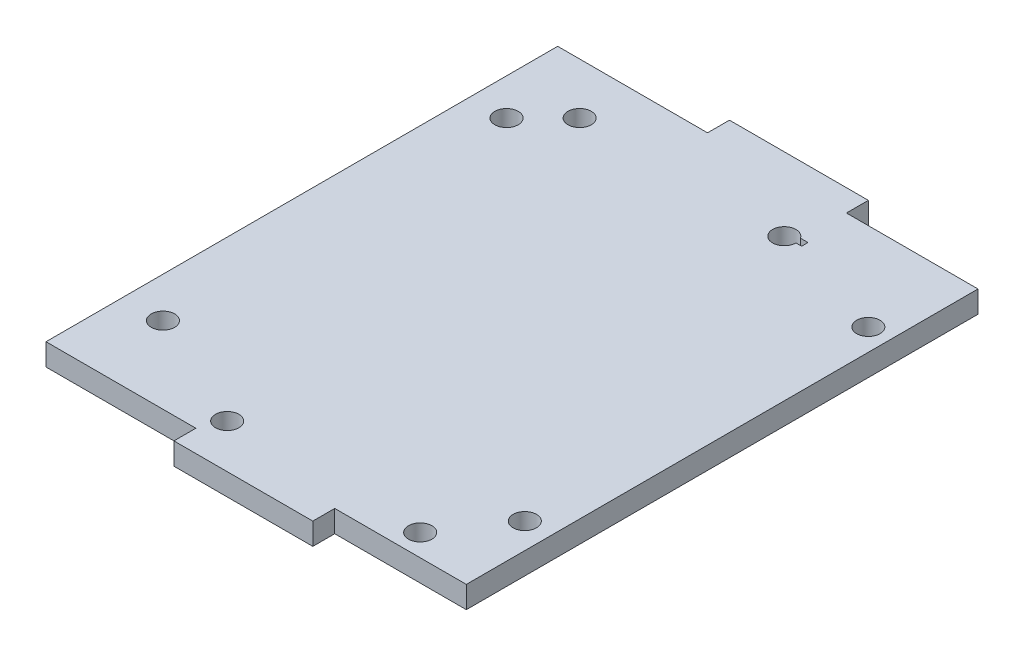
ISO-10303-21;
HEADER;
FILE_DESCRIPTION(('STEP AP214'),'2;1');
FILE_NAME('part.step','',(''),(''),'','','');
FILE_SCHEMA(('AUTOMOTIVE_DESIGN { 1 0 10303 214 1 1 1 1 }'));
ENDSEC;
DATA;
#1=APPLICATION_CONTEXT('core data for automotive mechanical design processes');
#2=APPLICATION_PROTOCOL_DEFINITION('international standard','automotive_design',2000,#1);
#3=PRODUCT_CONTEXT('',#1,'mechanical');
#4=PRODUCT('Part','Part','',(#3));
#5=PRODUCT_RELATED_PRODUCT_CATEGORY('part','',(#4));
#6=PRODUCT_DEFINITION_FORMATION('','',#4);
#7=PRODUCT_DEFINITION_CONTEXT('part definition',#1,'design');
#8=PRODUCT_DEFINITION('design','',#6,#7);
#9=PRODUCT_DEFINITION_SHAPE('','',#8);
#10=(LENGTH_UNIT() NAMED_UNIT(*) SI_UNIT(.MILLI.,.METRE.));
#11=(NAMED_UNIT(*) PLANE_ANGLE_UNIT() SI_UNIT($,.RADIAN.));
#12=(NAMED_UNIT(*) SI_UNIT($,.STERADIAN.) SOLID_ANGLE_UNIT());
#13=UNCERTAINTY_MEASURE_WITH_UNIT(LENGTH_MEASURE(1.E-05),#10,'distance_accuracy_value','');
#14=(GEOMETRIC_REPRESENTATION_CONTEXT(3) GLOBAL_UNCERTAINTY_ASSIGNED_CONTEXT((#13)) GLOBAL_UNIT_ASSIGNED_CONTEXT((#10,
#11,#12)) REPRESENTATION_CONTEXT('',''));
#15=CARTESIAN_POINT('',(0.,0.,0.));
#16=DIRECTION('',(0.,0.,1.));
#17=DIRECTION('',(1.,0.,0.));
#18=AXIS2_PLACEMENT_3D('',#15,#16,#17);
#19=CARTESIAN_POINT('',(0.,3.,35.));
#20=DIRECTION('',(0.,0.,-1.));
#21=DIRECTION('',(-1.,0.,0.));
#22=AXIS2_PLACEMENT_3D('',#19,#20,#21);
#23=PLANE('',#22);
#24=DIRECTION('',(1.,0.,0.));
#25=VECTOR('',#24,1.);
#26=CARTESIAN_POINT('',(0.,0.,35.));
#27=LINE('',#26,#25);
#28=CARTESIAN_POINT('',(6.29786164027668,0.,35.));
#29=VERTEX_POINT('',#28);
#30=CARTESIAN_POINT('',(26.7978616402767,0.,35.));
#31=VERTEX_POINT('',#30);
#32=EDGE_CURVE('E205',#29,#31,#27,.T.);
#33=ORIENTED_EDGE('',*,*,#32,.T.);
#34=DIRECTION('',(0.,-1.,0.));
#35=VECTOR('',#34,1.);
#36=CARTESIAN_POINT('',(26.7978616402767,3.,35.));
#37=LINE('',#36,#35);
#38=CARTESIAN_POINT('',(26.7978616402767,3.,35.));
#39=VERTEX_POINT('',#38);
#40=EDGE_CURVE('E11',#39,#31,#37,.T.);
#41=ORIENTED_EDGE('',*,*,#40,.F.);
#42=DIRECTION('',(1.,0.,0.));
#43=VECTOR('',#42,1.);
#44=CARTESIAN_POINT('',(0.,3.,35.));
#45=LINE('',#44,#43);
#46=CARTESIAN_POINT('',(6.29786164027668,3.,35.));
#47=VERTEX_POINT('',#46);
#48=EDGE_CURVE('E382',#47,#39,#45,.T.);
#49=ORIENTED_EDGE('',*,*,#48,.F.);
#50=DIRECTION('',(0.,-1.,0.));
#51=VECTOR('',#50,1.);
#52=CARTESIAN_POINT('',(6.29786164027668,3.,35.));
#53=LINE('',#52,#51);
#54=EDGE_CURVE('E233',#47,#29,#53,.T.);
#55=ORIENTED_EDGE('',*,*,#54,.T.);
#56=EDGE_LOOP('',(#33,#41,#49,#55));
#57=FACE_BOUND('',#56,.T.);
#58=ADVANCED_FACE('F36',(#57),#23,.F.);
#59=CARTESIAN_POINT('',(26.7978616402767,3.,0.));
#60=DIRECTION('',(1.,0.,0.));
#61=DIRECTION('',(0.,0.,-1.));
#62=AXIS2_PLACEMENT_3D('',#59,#60,#61);
#63=PLANE('',#62);
#64=DIRECTION('',(0.,0.,1.));
#65=VECTOR('',#64,1.);
#66=CARTESIAN_POINT('',(26.7978616402767,0.,0.));
#67=LINE('',#66,#65);
#68=CARTESIAN_POINT('',(26.7978616402767,0.,38.));
#69=VERTEX_POINT('',#68);
#70=EDGE_CURVE('E208',#31,#69,#67,.T.);
#71=ORIENTED_EDGE('',*,*,#70,.T.);
#72=DIRECTION('',(0.,-1.,0.));
#73=VECTOR('',#72,1.);
#74=CARTESIAN_POINT('',(26.7978616402767,3.,38.));
#75=LINE('',#74,#73);
#76=CARTESIAN_POINT('',(26.7978616402767,3.,38.));
#77=VERTEX_POINT('',#76);
#78=EDGE_CURVE('E46',#77,#69,#75,.T.);
#79=ORIENTED_EDGE('',*,*,#78,.F.);
#80=DIRECTION('',(0.,0.,1.));
#81=VECTOR('',#80,1.);
#82=CARTESIAN_POINT('',(26.7978616402767,3.,0.));
#83=LINE('',#82,#81);
#84=EDGE_CURVE('E383',#39,#77,#83,.T.);
#85=ORIENTED_EDGE('',*,*,#84,.F.);
#86=ORIENTED_EDGE('',*,*,#40,.T.);
#87=EDGE_LOOP('',(#71,#79,#85,#86));
#88=FACE_BOUND('',#87,.T.);
#89=ADVANCED_FACE('F289',(#88),#63,.F.);
#90=CARTESIAN_POINT('',(0.,3.,38.));
#91=DIRECTION('',(0.,0.,-1.));
#92=DIRECTION('',(-1.,0.,0.));
#93=AXIS2_PLACEMENT_3D('',#90,#91,#92);
#94=PLANE('',#93);
#95=DIRECTION('',(1.,0.,0.));
#96=VECTOR('',#95,1.);
#97=CARTESIAN_POINT('',(0.,0.,38.));
#98=LINE('',#97,#96);
#99=CARTESIAN_POINT('',(45.7978616402767,0.,38.));
#100=VERTEX_POINT('',#99);
#101=EDGE_CURVE('E210',#69,#100,#98,.T.);
#102=ORIENTED_EDGE('',*,*,#101,.T.);
#103=DIRECTION('',(0.,-1.,0.));
#104=VECTOR('',#103,1.);
#105=CARTESIAN_POINT('',(45.7978616402767,3.,38.));
#106=LINE('',#105,#104);
#107=CARTESIAN_POINT('',(45.7978616402767,3.,38.));
#108=VERTEX_POINT('',#107);
#109=EDGE_CURVE('E249',#108,#100,#106,.T.);
#110=ORIENTED_EDGE('',*,*,#109,.F.);
#111=DIRECTION('',(1.,0.,0.));
#112=VECTOR('',#111,1.);
#113=CARTESIAN_POINT('',(0.,3.,38.));
#114=LINE('',#113,#112);
#115=EDGE_CURVE('E386',#77,#108,#114,.T.);
#116=ORIENTED_EDGE('',*,*,#115,.F.);
#117=ORIENTED_EDGE('',*,*,#78,.T.);
#118=EDGE_LOOP('',(#102,#110,#116,#117));
#119=FACE_BOUND('',#118,.T.);
#120=ADVANCED_FACE('F295',(#119),#94,.F.);
#121=CARTESIAN_POINT('',(45.7978616402767,3.,0.));
#122=DIRECTION('',(-1.,0.,0.));
#123=DIRECTION('',(0.,0.,1.));
#124=AXIS2_PLACEMENT_3D('',#121,#122,#123);
#125=PLANE('',#124);
#126=DIRECTION('',(0.,0.,-1.));
#127=VECTOR('',#126,1.);
#128=CARTESIAN_POINT('',(45.7978616402767,0.,0.));
#129=LINE('',#128,#127);
#130=CARTESIAN_POINT('',(45.7978616402767,0.,35.));
#131=VERTEX_POINT('',#130);
#132=EDGE_CURVE('E212',#100,#131,#129,.T.);
#133=ORIENTED_EDGE('',*,*,#132,.T.);
#134=DIRECTION('',(0.,-1.,0.));
#135=VECTOR('',#134,1.);
#136=CARTESIAN_POINT('',(45.7978616402767,3.,35.));
#137=LINE('',#136,#135);
#138=CARTESIAN_POINT('',(45.7978616402767,3.,35.));
#139=VERTEX_POINT('',#138);
#140=EDGE_CURVE('E246',#139,#131,#137,.T.);
#141=ORIENTED_EDGE('',*,*,#140,.F.);
#142=DIRECTION('',(0.,0.,-1.));
#143=VECTOR('',#142,1.);
#144=CARTESIAN_POINT('',(45.7978616402767,3.,0.));
#145=LINE('',#144,#143);
#146=EDGE_CURVE('E358',#108,#139,#145,.T.);
#147=ORIENTED_EDGE('',*,*,#146,.F.);
#148=ORIENTED_EDGE('',*,*,#109,.T.);
#149=EDGE_LOOP('',(#133,#141,#147,#148));
#150=FACE_BOUND('',#149,.T.);
#151=ADVANCED_FACE('F342',(#150),#125,.F.);
#152=CARTESIAN_POINT('',(0.,3.,35.));
#153=DIRECTION('',(0.,0.,-1.));
#154=DIRECTION('',(-1.,0.,0.));
#155=AXIS2_PLACEMENT_3D('',#152,#153,#154);
#156=PLANE('',#155);
#157=DIRECTION('',(1.,0.,0.));
#158=VECTOR('',#157,1.);
#159=CARTESIAN_POINT('',(0.,0.,35.));
#160=LINE('',#159,#158);
#161=CARTESIAN_POINT('',(63.7978616402767,0.,35.));
#162=VERTEX_POINT('',#161);
#163=EDGE_CURVE('E214',#131,#162,#160,.T.);
#164=ORIENTED_EDGE('',*,*,#163,.T.);
#165=DIRECTION('',(0.,-1.,0.));
#166=VECTOR('',#165,1.);
#167=CARTESIAN_POINT('',(63.7978616402767,3.,35.));
#168=LINE('',#167,#166);
#169=CARTESIAN_POINT('',(63.7978616402767,3.,35.));
#170=VERTEX_POINT('',#169);
#171=EDGE_CURVE('E243',#170,#162,#168,.T.);
#172=ORIENTED_EDGE('',*,*,#171,.F.);
#173=DIRECTION('',(1.,0.,0.));
#174=VECTOR('',#173,1.);
#175=CARTESIAN_POINT('',(0.,3.,35.));
#176=LINE('',#175,#174);
#177=EDGE_CURVE('E370',#139,#170,#176,.T.);
#178=ORIENTED_EDGE('',*,*,#177,.F.);
#179=ORIENTED_EDGE('',*,*,#140,.T.);
#180=EDGE_LOOP('',(#164,#172,#178,#179));
#181=FACE_BOUND('',#180,.T.);
#182=ADVANCED_FACE('F338',(#181),#156,.F.);
#183=CARTESIAN_POINT('',(63.7978616402767,3.,0.));
#184=DIRECTION('',(-1.,0.,0.));
#185=DIRECTION('',(0.,0.,1.));
#186=AXIS2_PLACEMENT_3D('',#183,#184,#185);
#187=PLANE('',#186);
#188=DIRECTION('',(0.,0.,-1.));
#189=VECTOR('',#188,1.);
#190=CARTESIAN_POINT('',(63.7978616402767,0.,0.));
#191=LINE('',#190,#189);
#192=CARTESIAN_POINT('',(63.7978616402767,0.,-35.));
#193=VERTEX_POINT('',#192);
#194=EDGE_CURVE('E216',#162,#193,#191,.T.);
#195=ORIENTED_EDGE('',*,*,#194,.T.);
#196=DIRECTION('',(0.,-1.,0.));
#197=VECTOR('',#196,1.);
#198=CARTESIAN_POINT('',(63.7978616402767,3.,-35.));
#199=LINE('',#198,#197);
#200=CARTESIAN_POINT('',(63.7978616402767,3.,-35.));
#201=VERTEX_POINT('',#200);
#202=EDGE_CURVE('E241',#201,#193,#199,.T.);
#203=ORIENTED_EDGE('',*,*,#202,.F.);
#204=DIRECTION('',(0.,0.,-1.));
#205=VECTOR('',#204,1.);
#206=CARTESIAN_POINT('',(63.7978616402767,3.,0.));
#207=LINE('',#206,#205);
#208=EDGE_CURVE('E366',#170,#201,#207,.T.);
#209=ORIENTED_EDGE('',*,*,#208,.F.);
#210=ORIENTED_EDGE('',*,*,#171,.T.);
#211=EDGE_LOOP('',(#195,#203,#209,#210));
#212=FACE_BOUND('',#211,.T.);
#213=ADVANCED_FACE('F334',(#212),#187,.F.);
#214=CARTESIAN_POINT('',(0.,3.,-35.));
#215=DIRECTION('',(0.,0.,-1.));
#216=DIRECTION('',(-1.,0.,0.));
#217=AXIS2_PLACEMENT_3D('',#214,#215,#216);
#218=PLANE('',#217);
#219=DIRECTION('',(1.,0.,0.));
#220=VECTOR('',#219,1.);
#221=CARTESIAN_POINT('',(0.,0.,-35.));
#222=LINE('',#221,#220);
#223=CARTESIAN_POINT('',(45.7978616402767,0.,-35.));
#224=VERTEX_POINT('',#223);
#225=EDGE_CURVE('E219',#224,#193,#222,.T.);
#226=ORIENTED_EDGE('',*,*,#225,.F.);
#227=DIRECTION('',(0.,-1.,0.));
#228=VECTOR('',#227,1.);
#229=CARTESIAN_POINT('',(45.7978616402767,3.,-35.));
#230=LINE('',#229,#228);
#231=CARTESIAN_POINT('',(45.7978616402767,3.,-35.));
#232=VERTEX_POINT('',#231);
#233=EDGE_CURVE('E239',#232,#224,#230,.T.);
#234=ORIENTED_EDGE('',*,*,#233,.F.);
#235=DIRECTION('',(1.,0.,0.));
#236=VECTOR('',#235,1.);
#237=CARTESIAN_POINT('',(0.,3.,-35.));
#238=LINE('',#237,#236);
#239=EDGE_CURVE('E369',#232,#201,#238,.T.);
#240=ORIENTED_EDGE('',*,*,#239,.T.);
#241=ORIENTED_EDGE('',*,*,#202,.T.);
#242=EDGE_LOOP('',(#226,#234,#240,#241));
#243=FACE_BOUND('',#242,.T.);
#244=ADVANCED_FACE('F330',(#243),#218,.T.);
#245=CARTESIAN_POINT('',(45.7978616402767,3.,0.));
#246=DIRECTION('',(1.,0.,0.));
#247=DIRECTION('',(0.,0.,-1.));
#248=AXIS2_PLACEMENT_3D('',#245,#246,#247);
#249=PLANE('',#248);
#250=DIRECTION('',(0.,0.,1.));
#251=VECTOR('',#250,1.);
#252=CARTESIAN_POINT('',(45.7978616402767,0.,0.));
#253=LINE('',#252,#251);
#254=CARTESIAN_POINT('',(45.7978616402767,0.,-38.));
#255=VERTEX_POINT('',#254);
#256=EDGE_CURVE('E222',#255,#224,#253,.T.);
#257=ORIENTED_EDGE('',*,*,#256,.F.);
#258=DIRECTION('',(0.,-1.,0.));
#259=VECTOR('',#258,1.);
#260=CARTESIAN_POINT('',(45.7978616402767,3.,-38.));
#261=LINE('',#260,#259);
#262=CARTESIAN_POINT('',(45.7978616402767,3.,-38.));
#263=VERTEX_POINT('',#262);
#264=EDGE_CURVE('E237',#263,#255,#261,.T.);
#265=ORIENTED_EDGE('',*,*,#264,.F.);
#266=DIRECTION('',(0.,0.,1.));
#267=VECTOR('',#266,1.);
#268=CARTESIAN_POINT('',(45.7978616402767,3.,0.));
#269=LINE('',#268,#267);
#270=EDGE_CURVE('E372',#263,#232,#269,.T.);
#271=ORIENTED_EDGE('',*,*,#270,.T.);
#272=ORIENTED_EDGE('',*,*,#233,.T.);
#273=EDGE_LOOP('',(#257,#265,#271,#272));
#274=FACE_BOUND('',#273,.T.);
#275=ADVANCED_FACE('F326',(#274),#249,.T.);
#276=CARTESIAN_POINT('',(0.,3.,-38.));
#277=DIRECTION('',(0.,0.,-1.));
#278=DIRECTION('',(-1.,0.,0.));
#279=AXIS2_PLACEMENT_3D('',#276,#277,#278);
#280=PLANE('',#279);
#281=DIRECTION('',(1.,0.,0.));
#282=VECTOR('',#281,1.);
#283=CARTESIAN_POINT('',(0.,0.,-38.));
#284=LINE('',#283,#282);
#285=CARTESIAN_POINT('',(26.7978616402767,0.,-38.));
#286=VERTEX_POINT('',#285);
#287=EDGE_CURVE('E225',#286,#255,#284,.T.);
#288=ORIENTED_EDGE('',*,*,#287,.F.);
#289=DIRECTION('',(0.,-1.,0.));
#290=VECTOR('',#289,1.);
#291=CARTESIAN_POINT('',(26.7978616402767,3.,-38.));
#292=LINE('',#291,#290);
#293=CARTESIAN_POINT('',(26.7978616402767,3.,-38.));
#294=VERTEX_POINT('',#293);
#295=EDGE_CURVE('E168',#294,#286,#292,.T.);
#296=ORIENTED_EDGE('',*,*,#295,.F.);
#297=DIRECTION('',(1.,0.,0.));
#298=VECTOR('',#297,1.);
#299=CARTESIAN_POINT('',(0.,3.,-38.));
#300=LINE('',#299,#298);
#301=EDGE_CURVE('E175',#294,#263,#300,.T.);
#302=ORIENTED_EDGE('',*,*,#301,.T.);
#303=ORIENTED_EDGE('',*,*,#264,.T.);
#304=EDGE_LOOP('',(#288,#296,#302,#303));
#305=FACE_BOUND('',#304,.T.);
#306=ADVANCED_FACE('F323',(#305),#280,.T.);
#307=CARTESIAN_POINT('',(26.7978616402767,3.,0.));
#308=DIRECTION('',(-1.,0.,0.));
#309=DIRECTION('',(0.,0.,1.));
#310=AXIS2_PLACEMENT_3D('',#307,#308,#309);
#311=PLANE('',#310);
#312=DIRECTION('',(0.,0.,-1.));
#313=VECTOR('',#312,1.);
#314=CARTESIAN_POINT('',(26.7978616402767,0.,0.));
#315=LINE('',#314,#313);
#316=CARTESIAN_POINT('',(26.7978616402767,0.,-35.));
#317=VERTEX_POINT('',#316);
#318=EDGE_CURVE('E163',#317,#286,#315,.T.);
#319=ORIENTED_EDGE('',*,*,#318,.F.);
#320=DIRECTION('',(0.,-1.,0.));
#321=VECTOR('',#320,1.);
#322=CARTESIAN_POINT('',(26.7978616402767,3.,-35.));
#323=LINE('',#322,#321);
#324=CARTESIAN_POINT('',(26.7978616402767,3.,-35.));
#325=VERTEX_POINT('',#324);
#326=EDGE_CURVE('E158',#325,#317,#323,.T.);
#327=ORIENTED_EDGE('',*,*,#326,.F.);
#328=DIRECTION('',(0.,0.,-1.));
#329=VECTOR('',#328,1.);
#330=CARTESIAN_POINT('',(26.7978616402767,3.,0.));
#331=LINE('',#330,#329);
#332=EDGE_CURVE('E161',#325,#294,#331,.T.);
#333=ORIENTED_EDGE('',*,*,#332,.T.);
#334=ORIENTED_EDGE('',*,*,#295,.T.);
#335=EDGE_LOOP('',(#319,#327,#333,#334));
#336=FACE_BOUND('',#335,.T.);
#337=ADVANCED_FACE('F160',(#336),#311,.T.);
#338=CARTESIAN_POINT('',(0.,3.,-35.));
#339=DIRECTION('',(0.,0.,-1.));
#340=DIRECTION('',(-1.,0.,0.));
#341=AXIS2_PLACEMENT_3D('',#338,#339,#340);
#342=PLANE('',#341);
#343=DIRECTION('',(1.,0.,0.));
#344=VECTOR('',#343,1.);
#345=CARTESIAN_POINT('',(0.,0.,-35.));
#346=LINE('',#345,#344);
#347=CARTESIAN_POINT('',(6.29786164027668,0.,-35.));
#348=VERTEX_POINT('',#347);
#349=EDGE_CURVE('E229',#348,#317,#346,.T.);
#350=ORIENTED_EDGE('',*,*,#349,.F.);
#351=DIRECTION('',(0.,-1.,0.));
#352=VECTOR('',#351,1.);
#353=CARTESIAN_POINT('',(6.29786164027668,3.,-35.));
#354=LINE('',#353,#352);
#355=CARTESIAN_POINT('',(6.29786164027668,3.,-35.));
#356=VERTEX_POINT('',#355);
#357=EDGE_CURVE('E107',#356,#348,#354,.T.);
#358=ORIENTED_EDGE('',*,*,#357,.F.);
#359=DIRECTION('',(1.,0.,0.));
#360=VECTOR('',#359,1.);
#361=CARTESIAN_POINT('',(0.,3.,-35.));
#362=LINE('',#361,#360);
#363=EDGE_CURVE('E172',#356,#325,#362,.T.);
#364=ORIENTED_EDGE('',*,*,#363,.T.);
#365=ORIENTED_EDGE('',*,*,#326,.T.);
#366=EDGE_LOOP('',(#350,#358,#364,#365));
#367=FACE_BOUND('',#366,.T.);
#368=ADVANCED_FACE('F177',(#367),#342,.T.);
#369=CARTESIAN_POINT('',(44.2978616402767,3.,-28.));
#370=DIRECTION('',(0.,-1.,0.));
#371=DIRECTION('',(0.,0.,-1.));
#372=AXIS2_PLACEMENT_3D('',#369,#370,#371);
#373=CYLINDRICAL_SURFACE('',#372,1.6);
#374=CARTESIAN_POINT('',(44.2978616402767,0.,-28.));
#375=DIRECTION('',(0.,1.,0.));
#376=DIRECTION('',(0.,0.,1.));
#377=AXIS2_PLACEMENT_3D('',#374,#375,#376);
#378=CIRCLE('',#377,1.6);
#379=CARTESIAN_POINT('',(45.6374800853069,0.,-28.8748842333331));
#380=VERTEX_POINT('',#379);
#381=CARTESIAN_POINT('',(45.8978616402767,0.,-28.));
#382=VERTEX_POINT('',#381);
#383=EDGE_CURVE('E183',#380,#382,#378,.T.);
#384=ORIENTED_EDGE('',*,*,#383,.F.);
#385=DIRECTION('',(0.,-1.,0.));
#386=VECTOR('',#385,1.);
#387=CARTESIAN_POINT('',(45.6374800853069,3.,-28.8748842333331));
#388=LINE('',#387,#386);
#389=CARTESIAN_POINT('',(45.6374800853069,3.,-28.8748842333331));
#390=VERTEX_POINT('',#389);
#391=EDGE_CURVE('E40',#390,#380,#388,.T.);
#392=ORIENTED_EDGE('',*,*,#391,.F.);
#393=CARTESIAN_POINT('',(44.2978616402767,3.,-28.));
#394=DIRECTION('',(0.,1.,0.));
#395=DIRECTION('',(0.,0.,1.));
#396=AXIS2_PLACEMENT_3D('',#393,#394,#395);
#397=CIRCLE('',#396,1.6);
#398=CARTESIAN_POINT('',(45.8978616402767,3.,-28.));
#399=VERTEX_POINT('',#398);
#400=EDGE_CURVE('E232',#390,#399,#397,.T.);
#401=ORIENTED_EDGE('',*,*,#400,.T.);
#402=DIRECTION('',(0.,-1.,0.));
#403=VECTOR('',#402,1.);
#404=CARTESIAN_POINT('',(45.8978616402767,3.,-28.));
#405=LINE('',#404,#403);
#406=EDGE_CURVE('E179',#399,#382,#405,.T.);
#407=ORIENTED_EDGE('',*,*,#406,.T.);
#408=EDGE_LOOP('',(#384,#392,#401,#407));
#409=FACE_BOUND('',#408,.T.);
#410=ADVANCED_FACE('F38',(#409),#373,.F.);
#411=CARTESIAN_POINT('',(0.,3.,-28.8748842333331));
#412=DIRECTION('',(0.,0.,-1.));
#413=DIRECTION('',(-1.,0.,0.));
#414=AXIS2_PLACEMENT_3D('',#411,#412,#413);
#415=PLANE('',#414);
#416=DIRECTION('',(1.,0.,0.));
#417=VECTOR('',#416,1.);
#418=CARTESIAN_POINT('',(0.,0.,-28.8748842333331));
#419=LINE('',#418,#417);
#420=CARTESIAN_POINT('',(46.6680555557543,0.,-28.8748842333331));
#421=VERTEX_POINT('',#420);
#422=EDGE_CURVE('E186',#380,#421,#419,.T.);
#423=ORIENTED_EDGE('',*,*,#422,.T.);
#424=DIRECTION('',(0.,-1.,0.));
#425=VECTOR('',#424,1.);
#426=CARTESIAN_POINT('',(46.6680555557543,3.,-28.8748842333331));
#427=LINE('',#426,#425);
#428=CARTESIAN_POINT('',(46.6680555557543,3.,-28.8748842333331));
#429=VERTEX_POINT('',#428);
#430=EDGE_CURVE('E256',#429,#421,#427,.T.);
#431=ORIENTED_EDGE('',*,*,#430,.F.);
#432=DIRECTION('',(1.,0.,0.));
#433=VECTOR('',#432,1.);
#434=CARTESIAN_POINT('',(0.,3.,-28.8748842333331));
#435=LINE('',#434,#433);
#436=EDGE_CURVE('E264',#390,#429,#435,.T.);
#437=ORIENTED_EDGE('',*,*,#436,.F.);
#438=ORIENTED_EDGE('',*,*,#391,.T.);
#439=EDGE_LOOP('',(#423,#431,#437,#438));
#440=FACE_BOUND('',#439,.T.);
#441=ADVANCED_FACE('F263',(#440),#415,.F.);
#442=CARTESIAN_POINT('',(46.6680555557543,3.,0.));
#443=DIRECTION('',(-1.,0.,0.));
#444=DIRECTION('',(0.,0.,1.));
#445=AXIS2_PLACEMENT_3D('',#442,#443,#444);
#446=PLANE('',#445);
#447=DIRECTION('',(0.,0.,-1.));
#448=VECTOR('',#447,1.);
#449=CARTESIAN_POINT('',(46.6680555557543,0.,0.));
#450=LINE('',#449,#448);
#451=CARTESIAN_POINT('',(46.6680555557543,0.,-28.));
#452=VERTEX_POINT('',#451);
#453=EDGE_CURVE('E190',#452,#421,#450,.T.);
#454=ORIENTED_EDGE('',*,*,#453,.F.);
#455=DIRECTION('',(0.,-1.,0.));
#456=VECTOR('',#455,1.);
#457=CARTESIAN_POINT('',(46.6680555557543,3.,-28.));
#458=LINE('',#457,#456);
#459=CARTESIAN_POINT('',(46.6680555557543,3.,-28.));
#460=VERTEX_POINT('',#459);
#461=EDGE_CURVE('E255',#460,#452,#458,.T.);
#462=ORIENTED_EDGE('',*,*,#461,.F.);
#463=DIRECTION('',(0.,0.,-1.));
#464=VECTOR('',#463,1.);
#465=CARTESIAN_POINT('',(46.6680555557543,3.,0.));
#466=LINE('',#465,#464);
#467=EDGE_CURVE('E399',#460,#429,#466,.T.);
#468=ORIENTED_EDGE('',*,*,#467,.T.);
#469=ORIENTED_EDGE('',*,*,#430,.T.);
#470=EDGE_LOOP('',(#454,#462,#468,#469));
#471=FACE_BOUND('',#470,.T.);
#472=ADVANCED_FACE('F276',(#471),#446,.T.);
#473=CARTESIAN_POINT('',(11.7978616402767,3.,24.5));
#474=DIRECTION('',(0.,-1.,0.));
#475=DIRECTION('',(0.,0.,-1.));
#476=AXIS2_PLACEMENT_3D('',#473,#474,#475);
#477=CYLINDRICAL_SURFACE('',#476,1.6);
#478=CARTESIAN_POINT('',(11.7978616402767,3.,24.5));
#479=DIRECTION('',(0.,1.,0.));
#480=DIRECTION('',(0.,0.,1.));
#481=AXIS2_PLACEMENT_3D('',#478,#479,#480);
#482=CIRCLE('',#481,1.6);
#483=CARTESIAN_POINT('',(11.7978616402767,3.,26.1));
#484=VERTEX_POINT('',#483);
#485=EDGE_CURVE('E384',#484,#484,#482,.T.);
#486=ORIENTED_EDGE('',*,*,#485,.T.);
#487=EDGE_LOOP('',(#486));
#488=FACE_BOUND('',#487,.T.);
#489=CARTESIAN_POINT('',(11.7978616402767,0.,24.5));
#490=DIRECTION('',(0.,1.,0.));
#491=DIRECTION('',(0.,0.,1.));
#492=AXIS2_PLACEMENT_3D('',#489,#490,#491);
#493=CIRCLE('',#492,1.6);
#494=CARTESIAN_POINT('',(11.7978616402767,0.,26.1));
#495=VERTEX_POINT('',#494);
#496=EDGE_CURVE('E202',#495,#495,#493,.T.);
#497=ORIENTED_EDGE('',*,*,#496,.F.);
#498=EDGE_LOOP('',(#497));
#499=FACE_BOUND('',#498,.T.);
#500=ADVANCED_FACE('F278',(#488,#499),#477,.F.);
#501=CARTESIAN_POINT('',(60.2978616402767,3.,23.5));
#502=DIRECTION('',(0.,-1.,0.));
#503=DIRECTION('',(0.,0.,-1.));
#504=AXIS2_PLACEMENT_3D('',#501,#502,#503);
#505=CYLINDRICAL_SURFACE('',#504,1.6);
#506=CARTESIAN_POINT('',(60.2978616402767,3.,23.5));
#507=DIRECTION('',(0.,1.,0.));
#508=DIRECTION('',(0.,0.,1.));
#509=AXIS2_PLACEMENT_3D('',#506,#507,#508);
#510=CIRCLE('',#509,1.6);
#511=CARTESIAN_POINT('',(60.2978616402767,3.,25.1));
#512=VERTEX_POINT('',#511);
#513=EDGE_CURVE('E389',#512,#512,#510,.T.);
#514=ORIENTED_EDGE('',*,*,#513,.T.);
#515=EDGE_LOOP('',(#514));
#516=FACE_BOUND('',#515,.T.);
#517=CARTESIAN_POINT('',(60.2978616402767,0.,23.5));
#518=DIRECTION('',(0.,1.,0.));
#519=DIRECTION('',(0.,0.,1.));
#520=AXIS2_PLACEMENT_3D('',#517,#518,#519);
#521=CIRCLE('',#520,1.6);
#522=CARTESIAN_POINT('',(60.2978616402767,0.,25.1));
#523=VERTEX_POINT('',#522);
#524=EDGE_CURVE('E199',#523,#523,#521,.T.);
#525=ORIENTED_EDGE('',*,*,#524,.F.);
#526=EDGE_LOOP('',(#525));
#527=FACE_BOUND('',#526,.T.);
#528=ADVANCED_FACE('F284',(#516,#527),#505,.F.);
#529=CARTESIAN_POINT('',(16.2978616402767,3.,-28.));
#530=DIRECTION('',(0.,-1.,0.));
#531=DIRECTION('',(0.,0.,-1.));
#532=AXIS2_PLACEMENT_3D('',#529,#530,#531);
#533=CYLINDRICAL_SURFACE('',#532,1.6);
#534=CARTESIAN_POINT('',(16.2978616402767,3.,-28.));
#535=DIRECTION('',(0.,1.,0.));
#536=DIRECTION('',(0.,0.,1.));
#537=AXIS2_PLACEMENT_3D('',#534,#535,#536);
#538=CIRCLE('',#537,1.6);
#539=CARTESIAN_POINT('',(16.2978616402767,3.,-26.4));
#540=VERTEX_POINT('',#539);
#541=EDGE_CURVE('E395',#540,#540,#538,.T.);
#542=ORIENTED_EDGE('',*,*,#541,.T.);
#543=EDGE_LOOP('',(#542));
#544=FACE_BOUND('',#543,.T.);
#545=CARTESIAN_POINT('',(16.2978616402767,0.,-28.));
#546=DIRECTION('',(0.,1.,0.));
#547=DIRECTION('',(0.,0.,1.));
#548=AXIS2_PLACEMENT_3D('',#545,#546,#547);
#549=CIRCLE('',#548,1.6);
#550=CARTESIAN_POINT('',(16.2978616402767,0.,-26.4));
#551=VERTEX_POINT('',#550);
#552=EDGE_CURVE('E196',#551,#551,#549,.T.);
#553=ORIENTED_EDGE('',*,*,#552,.F.);
#554=EDGE_LOOP('',(#553));
#555=FACE_BOUND('',#554,.T.);
#556=ADVANCED_FACE('F302',(#544,#555),#533,.F.);
#557=CARTESIAN_POINT('',(0.,3.,-28.));
#558=DIRECTION('',(0.,0.,-1.));
#559=DIRECTION('',(-1.,0.,0.));
#560=AXIS2_PLACEMENT_3D('',#557,#558,#559);
#561=PLANE('',#560);
#562=DIRECTION('',(1.,0.,0.));
#563=VECTOR('',#562,1.);
#564=CARTESIAN_POINT('',(0.,0.,-28.));
#565=LINE('',#564,#563);
#566=EDGE_CURVE('E193',#382,#452,#565,.T.);
#567=ORIENTED_EDGE('',*,*,#566,.F.);
#568=ORIENTED_EDGE('',*,*,#406,.F.);
#569=DIRECTION('',(1.,0.,0.));
#570=VECTOR('',#569,1.);
#571=CARTESIAN_POINT('',(0.,3.,-28.));
#572=LINE('',#571,#570);
#573=EDGE_CURVE('E274',#399,#460,#572,.T.);
#574=ORIENTED_EDGE('',*,*,#573,.T.);
#575=ORIENTED_EDGE('',*,*,#461,.T.);
#576=EDGE_LOOP('',(#567,#568,#574,#575));
#577=FACE_BOUND('',#576,.T.);
#578=ADVANCED_FACE('F273',(#577),#561,.T.);
#579=CARTESIAN_POINT('',(6.29786164027668,3.,0.));
#580=DIRECTION('',(1.,0.,0.));
#581=DIRECTION('',(0.,0.,-1.));
#582=AXIS2_PLACEMENT_3D('',#579,#580,#581);
#583=PLANE('',#582);
#584=DIRECTION('',(0.,0.,1.));
#585=VECTOR('',#584,1.);
#586=CARTESIAN_POINT('',(6.29786164027668,0.,0.));
#587=LINE('',#586,#585);
#588=EDGE_CURVE('E110',#348,#29,#587,.T.);
#589=ORIENTED_EDGE('',*,*,#588,.T.);
#590=ORIENTED_EDGE('',*,*,#54,.F.);
#591=DIRECTION('',(0.,0.,1.));
#592=VECTOR('',#591,1.);
#593=CARTESIAN_POINT('',(6.29786164027668,3.,0.));
#594=LINE('',#593,#592);
#595=EDGE_CURVE('E55',#356,#47,#594,.T.);
#596=ORIENTED_EDGE('',*,*,#595,.F.);
#597=ORIENTED_EDGE('',*,*,#357,.T.);
#598=EDGE_LOOP('',(#589,#590,#596,#597));
#599=FACE_BOUND('',#598,.T.);
#600=ADVANCED_FACE('F307',(#599),#583,.F.);
#601=CARTESIAN_POINT('',(0.,3.,0.));
#602=DIRECTION('',(0.,1.,0.));
#603=DIRECTION('',(0.,0.,1.));
#604=AXIS2_PLACEMENT_3D('',#601,#602,#603);
#605=PLANE('',#604);
#606=CARTESIAN_POINT('',(28.0878616402767,3.,32.));
#607=DIRECTION('',(0.,1.,0.));
#608=DIRECTION('',(0.,0.,1.));
#609=AXIS2_PLACEMENT_3D('',#606,#607,#608);
#610=CIRCLE('',#609,1.6);
#611=CARTESIAN_POINT('',(28.0878616402767,3.,33.6));
#612=VERTEX_POINT('',#611);
#613=EDGE_CURVE('E420',#612,#612,#610,.T.);
#614=ORIENTED_EDGE('',*,*,#613,.F.);
#615=EDGE_LOOP('',(#614));
#616=FACE_BOUND('',#615,.T.);
#617=CARTESIAN_POINT('',(54.4878616402767,3.,32.));
#618=DIRECTION('',(0.,1.,0.));
#619=DIRECTION('',(0.,0.,1.));
#620=AXIS2_PLACEMENT_3D('',#617,#618,#619);
#621=CIRCLE('',#620,1.6);
#622=CARTESIAN_POINT('',(54.4878616402767,3.,33.6));
#623=VERTEX_POINT('',#622);
#624=EDGE_CURVE('E414',#623,#623,#621,.T.);
#625=ORIENTED_EDGE('',*,*,#624,.F.);
#626=EDGE_LOOP('',(#625));
#627=FACE_BOUND('',#626,.T.);
#628=CARTESIAN_POINT('',(60.7978616402767,3.,-23.));
#629=DIRECTION('',(0.,1.,0.));
#630=DIRECTION('',(0.,0.,1.));
#631=AXIS2_PLACEMENT_3D('',#628,#629,#630);
#632=CIRCLE('',#631,1.6);
#633=CARTESIAN_POINT('',(60.7978616402767,3.,-21.4));
#634=VERTEX_POINT('',#633);
#635=EDGE_CURVE('E408',#634,#634,#632,.T.);
#636=ORIENTED_EDGE('',*,*,#635,.F.);
#637=EDGE_LOOP('',(#636));
#638=FACE_BOUND('',#637,.T.);
#639=CARTESIAN_POINT('',(11.2978616402767,3.,-23.));
#640=DIRECTION('',(0.,1.,0.));
#641=DIRECTION('',(0.,0.,1.));
#642=AXIS2_PLACEMENT_3D('',#639,#640,#641);
#643=CIRCLE('',#642,1.6);
#644=CARTESIAN_POINT('',(11.2978616402767,3.,-21.4));
#645=VERTEX_POINT('',#644);
#646=EDGE_CURVE('E187',#645,#645,#643,.T.);
#647=ORIENTED_EDGE('',*,*,#646,.F.);
#648=EDGE_LOOP('',(#647));
#649=FACE_BOUND('',#648,.T.);
#650=ORIENTED_EDGE('',*,*,#400,.F.);
#651=ORIENTED_EDGE('',*,*,#436,.T.);
#652=ORIENTED_EDGE('',*,*,#467,.F.);
#653=ORIENTED_EDGE('',*,*,#573,.F.);
#654=EDGE_LOOP('',(#650,#651,#652,#653));
#655=FACE_BOUND('',#654,.T.);
#656=ORIENTED_EDGE('',*,*,#541,.F.);
#657=EDGE_LOOP('',(#656));
#658=FACE_BOUND('',#657,.T.);
#659=ORIENTED_EDGE('',*,*,#513,.F.);
#660=EDGE_LOOP('',(#659));
#661=FACE_BOUND('',#660,.T.);
#662=ORIENTED_EDGE('',*,*,#485,.F.);
#663=EDGE_LOOP('',(#662));
#664=FACE_BOUND('',#663,.T.);
#665=ORIENTED_EDGE('',*,*,#48,.T.);
#666=ORIENTED_EDGE('',*,*,#84,.T.);
#667=ORIENTED_EDGE('',*,*,#115,.T.);
#668=ORIENTED_EDGE('',*,*,#146,.T.);
#669=ORIENTED_EDGE('',*,*,#177,.T.);
#670=ORIENTED_EDGE('',*,*,#208,.T.);
#671=ORIENTED_EDGE('',*,*,#239,.F.);
#672=ORIENTED_EDGE('',*,*,#270,.F.);
#673=ORIENTED_EDGE('',*,*,#301,.F.);
#674=ORIENTED_EDGE('',*,*,#332,.F.);
#675=ORIENTED_EDGE('',*,*,#363,.F.);
#676=ORIENTED_EDGE('',*,*,#595,.T.);
#677=EDGE_LOOP('',(#665,#666,#667,#668,#669,#670,#671,#672,#673,#674,#675,#676));
#678=FACE_BOUND('',#677,.T.);
#679=ADVANCED_FACE('F171',(#616,#627,#638,#649,#655,#658,#661,#664,#678),#605,.T.);
#680=CARTESIAN_POINT('',(0.,0.,0.));
#681=DIRECTION('',(0.,1.,0.));
#682=DIRECTION('',(0.,0.,1.));
#683=AXIS2_PLACEMENT_3D('',#680,#681,#682);
#684=PLANE('',#683);
#685=CARTESIAN_POINT('',(28.0878616402767,0.,32.));
#686=DIRECTION('',(0.,-1.,0.));
#687=DIRECTION('',(0.,0.,-1.));
#688=AXIS2_PLACEMENT_3D('',#685,#686,#687);
#689=CIRCLE('',#688,1.6);
#690=CARTESIAN_POINT('',(28.0878616402767,0.,30.4));
#691=VERTEX_POINT('',#690);
#692=EDGE_CURVE('E423',#691,#691,#689,.T.);
#693=ORIENTED_EDGE('',*,*,#692,.F.);
#694=EDGE_LOOP('',(#693));
#695=FACE_BOUND('',#694,.T.);
#696=CARTESIAN_POINT('',(54.4878616402767,0.,32.));
#697=DIRECTION('',(0.,-1.,0.));
#698=DIRECTION('',(0.,0.,-1.));
#699=AXIS2_PLACEMENT_3D('',#696,#697,#698);
#700=CIRCLE('',#699,1.6);
#701=CARTESIAN_POINT('',(54.4878616402767,0.,30.4));
#702=VERTEX_POINT('',#701);
#703=EDGE_CURVE('E417',#702,#702,#700,.T.);
#704=ORIENTED_EDGE('',*,*,#703,.F.);
#705=EDGE_LOOP('',(#704));
#706=FACE_BOUND('',#705,.T.);
#707=CARTESIAN_POINT('',(60.7978616402767,0.,-23.));
#708=DIRECTION('',(0.,-1.,0.));
#709=DIRECTION('',(0.,0.,-1.));
#710=AXIS2_PLACEMENT_3D('',#707,#708,#709);
#711=CIRCLE('',#710,1.6);
#712=CARTESIAN_POINT('',(60.7978616402767,0.,-24.6));
#713=VERTEX_POINT('',#712);
#714=EDGE_CURVE('E411',#713,#713,#711,.T.);
#715=ORIENTED_EDGE('',*,*,#714,.F.);
#716=EDGE_LOOP('',(#715));
#717=FACE_BOUND('',#716,.T.);
#718=CARTESIAN_POINT('',(11.2978616402767,0.,-23.));
#719=DIRECTION('',(0.,-1.,0.));
#720=DIRECTION('',(0.,0.,-1.));
#721=AXIS2_PLACEMENT_3D('',#718,#719,#720);
#722=CIRCLE('',#721,1.6);
#723=CARTESIAN_POINT('',(11.2978616402767,0.,-24.6));
#724=VERTEX_POINT('',#723);
#725=EDGE_CURVE('E405',#724,#724,#722,.T.);
#726=ORIENTED_EDGE('',*,*,#725,.F.);
#727=EDGE_LOOP('',(#726));
#728=FACE_BOUND('',#727,.T.);
#729=ORIENTED_EDGE('',*,*,#383,.T.);
#730=ORIENTED_EDGE('',*,*,#566,.T.);
#731=ORIENTED_EDGE('',*,*,#453,.T.);
#732=ORIENTED_EDGE('',*,*,#422,.F.);
#733=EDGE_LOOP('',(#729,#730,#731,#732));
#734=FACE_BOUND('',#733,.T.);
#735=ORIENTED_EDGE('',*,*,#552,.T.);
#736=EDGE_LOOP('',(#735));
#737=FACE_BOUND('',#736,.T.);
#738=ORIENTED_EDGE('',*,*,#524,.T.);
#739=EDGE_LOOP('',(#738));
#740=FACE_BOUND('',#739,.T.);
#741=ORIENTED_EDGE('',*,*,#496,.T.);
#742=EDGE_LOOP('',(#741));
#743=FACE_BOUND('',#742,.T.);
#744=ORIENTED_EDGE('',*,*,#32,.F.);
#745=ORIENTED_EDGE('',*,*,#588,.F.);
#746=ORIENTED_EDGE('',*,*,#349,.T.);
#747=ORIENTED_EDGE('',*,*,#318,.T.);
#748=ORIENTED_EDGE('',*,*,#287,.T.);
#749=ORIENTED_EDGE('',*,*,#256,.T.);
#750=ORIENTED_EDGE('',*,*,#225,.T.);
#751=ORIENTED_EDGE('',*,*,#194,.F.);
#752=ORIENTED_EDGE('',*,*,#163,.F.);
#753=ORIENTED_EDGE('',*,*,#132,.F.);
#754=ORIENTED_EDGE('',*,*,#101,.F.);
#755=ORIENTED_EDGE('',*,*,#70,.F.);
#756=EDGE_LOOP('',(#744,#745,#746,#747,#748,#749,#750,#751,#752,#753,#754,#755));
#757=FACE_BOUND('',#756,.T.);
#758=ADVANCED_FACE('F267',(#695,#706,#717,#728,#734,#737,#740,#743,#757),#684,.F.);
#759=CARTESIAN_POINT('',(11.2978616402767,10.,-23.));
#760=DIRECTION('',(0.,-1.,0.));
#761=DIRECTION('',(0.,0.,-1.));
#762=AXIS2_PLACEMENT_3D('',#759,#760,#761);
#763=CYLINDRICAL_SURFACE('',#762,1.6);
#764=ORIENTED_EDGE('',*,*,#646,.T.);
#765=EDGE_LOOP('',(#764));
#766=FACE_BOUND('',#765,.T.);
#767=ORIENTED_EDGE('',*,*,#725,.T.);
#768=EDGE_LOOP('',(#767));
#769=FACE_BOUND('',#768,.T.);
#770=ADVANCED_FACE('F431',(#766,#769),#763,.F.);
#771=CARTESIAN_POINT('',(60.7978616402767,10.,-23.));
#772=DIRECTION('',(0.,-1.,0.));
#773=DIRECTION('',(0.,0.,-1.));
#774=AXIS2_PLACEMENT_3D('',#771,#772,#773);
#775=CYLINDRICAL_SURFACE('',#774,1.6);
#776=ORIENTED_EDGE('',*,*,#635,.T.);
#777=EDGE_LOOP('',(#776));
#778=FACE_BOUND('',#777,.T.);
#779=ORIENTED_EDGE('',*,*,#714,.T.);
#780=EDGE_LOOP('',(#779));
#781=FACE_BOUND('',#780,.T.);
#782=ADVANCED_FACE('F439',(#778,#781),#775,.F.);
#783=CARTESIAN_POINT('',(54.4878616402767,10.,32.));
#784=DIRECTION('',(0.,-1.,0.));
#785=DIRECTION('',(0.,0.,-1.));
#786=AXIS2_PLACEMENT_3D('',#783,#784,#785);
#787=CYLINDRICAL_SURFACE('',#786,1.6);
#788=ORIENTED_EDGE('',*,*,#624,.T.);
#789=EDGE_LOOP('',(#788));
#790=FACE_BOUND('',#789,.T.);
#791=ORIENTED_EDGE('',*,*,#703,.T.);
#792=EDGE_LOOP('',(#791));
#793=FACE_BOUND('',#792,.T.);
#794=ADVANCED_FACE('F445',(#790,#793),#787,.F.);
#795=CARTESIAN_POINT('',(28.0878616402767,10.,32.));
#796=DIRECTION('',(0.,-1.,0.));
#797=DIRECTION('',(0.,0.,-1.));
#798=AXIS2_PLACEMENT_3D('',#795,#796,#797);
#799=CYLINDRICAL_SURFACE('',#798,1.6);
#800=ORIENTED_EDGE('',*,*,#613,.T.);
#801=EDGE_LOOP('',(#800));
#802=FACE_BOUND('',#801,.T.);
#803=ORIENTED_EDGE('',*,*,#692,.T.);
#804=EDGE_LOOP('',(#803));
#805=FACE_BOUND('',#804,.T.);
#806=ADVANCED_FACE('F427',(#802,#805),#799,.F.);
#807=CLOSED_SHELL('',(#58,#89,#120,#151,#182,#213,#244,#275,#306,#337,#368,#410,#441,#472,#500,
#528,#556,#578,#600,#679,#758,#770,#782,#794,#806));
#808=MANIFOLD_SOLID_BREP('B2',#807);
#809=ADVANCED_BREP_SHAPE_REPRESENTATION('',(#18,#808),#14);
#810=SHAPE_DEFINITION_REPRESENTATION(#9,#809);
ENDSEC;
END-ISO-10303-21;
